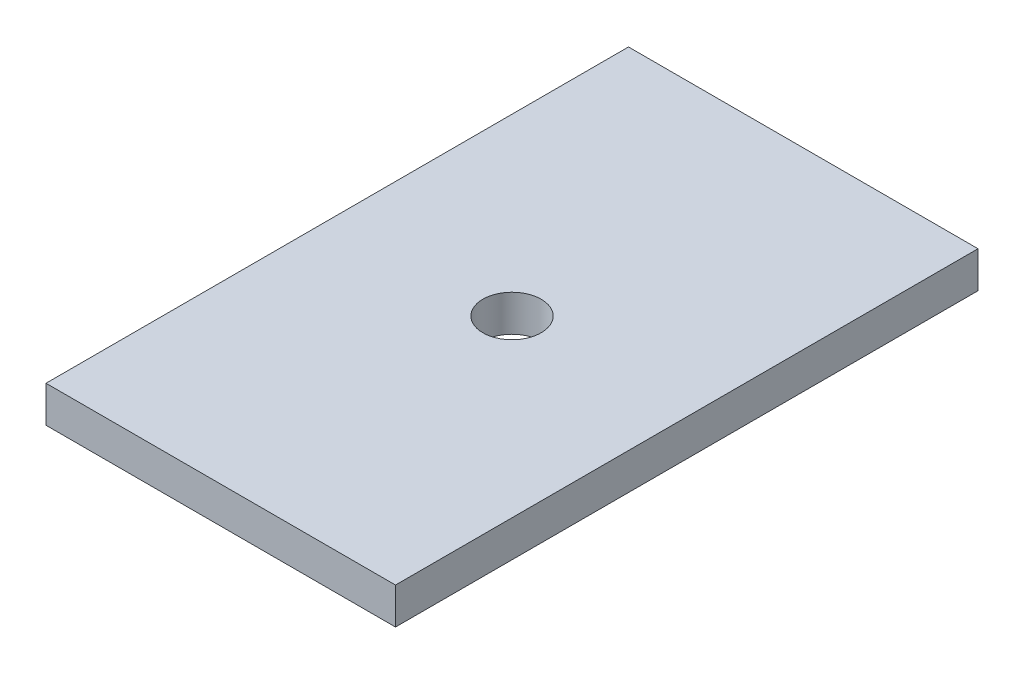
ISO-10303-21;
HEADER;
FILE_DESCRIPTION(('STEP AP214'),'2;1');
FILE_NAME('part.step','',(''),(''),'','','');
FILE_SCHEMA(('AUTOMOTIVE_DESIGN { 1 0 10303 214 1 1 1 1 }'));
ENDSEC;
DATA;
#1=APPLICATION_CONTEXT('core data for automotive mechanical design processes');
#2=APPLICATION_PROTOCOL_DEFINITION('international standard','automotive_design',2000,#1);
#3=PRODUCT_CONTEXT('',#1,'mechanical');
#4=PRODUCT('Part','Part','',(#3));
#5=PRODUCT_RELATED_PRODUCT_CATEGORY('part','',(#4));
#6=PRODUCT_DEFINITION_FORMATION('','',#4);
#7=PRODUCT_DEFINITION_CONTEXT('part definition',#1,'design');
#8=PRODUCT_DEFINITION('design','',#6,#7);
#9=PRODUCT_DEFINITION_SHAPE('','',#8);
#10=(LENGTH_UNIT() NAMED_UNIT(*) SI_UNIT(.MILLI.,.METRE.));
#11=(NAMED_UNIT(*) PLANE_ANGLE_UNIT() SI_UNIT($,.RADIAN.));
#12=(NAMED_UNIT(*) SI_UNIT($,.STERADIAN.) SOLID_ANGLE_UNIT());
#13=UNCERTAINTY_MEASURE_WITH_UNIT(LENGTH_MEASURE(1.E-05),#10,'distance_accuracy_value','');
#14=(GEOMETRIC_REPRESENTATION_CONTEXT(3) GLOBAL_UNCERTAINTY_ASSIGNED_CONTEXT((#13)) GLOBAL_UNIT_ASSIGNED_CONTEXT((#10,
#11,#12)) REPRESENTATION_CONTEXT('',''));
#15=CARTESIAN_POINT('',(0.,0.,0.));
#16=DIRECTION('',(0.,0.,1.));
#17=DIRECTION('',(1.,0.,0.));
#18=AXIS2_PLACEMENT_3D('',#15,#16,#17);
#19=CARTESIAN_POINT('',(152.4,31.75,0.));
#20=DIRECTION('',(1.,0.,0.));
#21=DIRECTION('',(0.,0.,-1.));
#22=AXIS2_PLACEMENT_3D('',#19,#20,#21);
#23=PLANE('',#22);
#24=DIRECTION('',(0.,0.,1.));
#25=VECTOR('',#24,1.);
#26=CARTESIAN_POINT('',(152.4,0.,0.));
#27=LINE('',#26,#25);
#28=CARTESIAN_POINT('',(152.4,0.,0.));
#29=VERTEX_POINT('',#28);
#30=CARTESIAN_POINT('',(152.4,0.,508.));
#31=VERTEX_POINT('',#30);
#32=EDGE_CURVE('E98',#29,#31,#27,.T.);
#33=ORIENTED_EDGE('',*,*,#32,.F.);
#34=DIRECTION('',(0.,-1.,0.));
#35=VECTOR('',#34,1.);
#36=CARTESIAN_POINT('',(152.4,31.75,0.));
#37=LINE('',#36,#35);
#38=CARTESIAN_POINT('',(152.4,31.75,0.));
#39=VERTEX_POINT('',#38);
#40=EDGE_CURVE('E11',#39,#29,#37,.T.);
#41=ORIENTED_EDGE('',*,*,#40,.F.);
#42=DIRECTION('',(0.,0.,1.));
#43=VECTOR('',#42,1.);
#44=CARTESIAN_POINT('',(152.4,31.75,0.));
#45=LINE('',#44,#43);
#46=CARTESIAN_POINT('',(152.4,31.75,508.));
#47=VERTEX_POINT('',#46);
#48=EDGE_CURVE('E90',#39,#47,#45,.T.);
#49=ORIENTED_EDGE('',*,*,#48,.T.);
#50=DIRECTION('',(0.,-1.,0.));
#51=VECTOR('',#50,1.);
#52=CARTESIAN_POINT('',(152.4,31.75,508.));
#53=LINE('',#52,#51);
#54=EDGE_CURVE('E37',#47,#31,#53,.T.);
#55=ORIENTED_EDGE('',*,*,#54,.T.);
#56=EDGE_LOOP('',(#33,#41,#49,#55));
#57=FACE_BOUND('',#56,.T.);
#58=ADVANCED_FACE('F34',(#57),#23,.T.);
#59=CARTESIAN_POINT('',(152.4,31.75,0.));
#60=DIRECTION('',(0.,0.,1.));
#61=DIRECTION('',(1.,0.,0.));
#62=AXIS2_PLACEMENT_3D('',#59,#60,#61);
#63=PLANE('',#62);
#64=DIRECTION('',(-1.,0.,0.));
#65=VECTOR('',#64,1.);
#66=CARTESIAN_POINT('',(152.4,0.,0.));
#67=LINE('',#66,#65);
#68=CARTESIAN_POINT('',(-152.4,0.,0.));
#69=VERTEX_POINT('',#68);
#70=EDGE_CURVE('E105',#29,#69,#67,.T.);
#71=ORIENTED_EDGE('',*,*,#70,.T.);
#72=DIRECTION('',(0.,-1.,0.));
#73=VECTOR('',#72,1.);
#74=CARTESIAN_POINT('',(-152.4,31.75,0.));
#75=LINE('',#74,#73);
#76=CARTESIAN_POINT('',(-152.4,31.75,0.));
#77=VERTEX_POINT('',#76);
#78=EDGE_CURVE('E43',#77,#69,#75,.T.);
#79=ORIENTED_EDGE('',*,*,#78,.F.);
#80=DIRECTION('',(-1.,0.,0.));
#81=VECTOR('',#80,1.);
#82=CARTESIAN_POINT('',(152.4,31.75,0.));
#83=LINE('',#82,#81);
#84=EDGE_CURVE('E93',#39,#77,#83,.T.);
#85=ORIENTED_EDGE('',*,*,#84,.F.);
#86=ORIENTED_EDGE('',*,*,#40,.T.);
#87=EDGE_LOOP('',(#71,#79,#85,#86));
#88=FACE_BOUND('',#87,.T.);
#89=ADVANCED_FACE('F131',(#88),#63,.F.);
#90=CARTESIAN_POINT('',(-152.4,31.75,508.));
#91=DIRECTION('',(-1.,0.,0.));
#92=DIRECTION('',(0.,0.,1.));
#93=AXIS2_PLACEMENT_3D('',#90,#91,#92);
#94=PLANE('',#93);
#95=DIRECTION('',(0.,0.,-1.));
#96=VECTOR('',#95,1.);
#97=CARTESIAN_POINT('',(-152.4,0.,508.));
#98=LINE('',#97,#96);
#99=CARTESIAN_POINT('',(-152.4,0.,508.));
#100=VERTEX_POINT('',#99);
#101=EDGE_CURVE('E85',#100,#69,#98,.T.);
#102=ORIENTED_EDGE('',*,*,#101,.F.);
#103=DIRECTION('',(0.,-1.,0.));
#104=VECTOR('',#103,1.);
#105=CARTESIAN_POINT('',(-152.4,31.75,508.));
#106=LINE('',#105,#104);
#107=CARTESIAN_POINT('',(-152.4,31.75,508.));
#108=VERTEX_POINT('',#107);
#109=EDGE_CURVE('E81',#108,#100,#106,.T.);
#110=ORIENTED_EDGE('',*,*,#109,.F.);
#111=DIRECTION('',(0.,0.,-1.));
#112=VECTOR('',#111,1.);
#113=CARTESIAN_POINT('',(-152.4,31.75,508.));
#114=LINE('',#113,#112);
#115=EDGE_CURVE('E83',#108,#77,#114,.T.);
#116=ORIENTED_EDGE('',*,*,#115,.T.);
#117=ORIENTED_EDGE('',*,*,#78,.T.);
#118=EDGE_LOOP('',(#102,#110,#116,#117));
#119=FACE_BOUND('',#118,.T.);
#120=ADVANCED_FACE('F82',(#119),#94,.T.);
#121=CARTESIAN_POINT('',(-152.4,31.75,508.));
#122=DIRECTION('',(0.,0.,-1.));
#123=DIRECTION('',(-1.,0.,0.));
#124=AXIS2_PLACEMENT_3D('',#121,#122,#123);
#125=PLANE('',#124);
#126=DIRECTION('',(1.,0.,0.));
#127=VECTOR('',#126,1.);
#128=CARTESIAN_POINT('',(-152.4,0.,508.));
#129=LINE('',#128,#127);
#130=EDGE_CURVE('E101',#100,#31,#129,.T.);
#131=ORIENTED_EDGE('',*,*,#130,.T.);
#132=ORIENTED_EDGE('',*,*,#54,.F.);
#133=DIRECTION('',(1.,0.,0.));
#134=VECTOR('',#133,1.);
#135=CARTESIAN_POINT('',(-152.4,31.75,508.));
#136=LINE('',#135,#134);
#137=EDGE_CURVE('E78',#108,#47,#136,.T.);
#138=ORIENTED_EDGE('',*,*,#137,.F.);
#139=ORIENTED_EDGE('',*,*,#109,.T.);
#140=EDGE_LOOP('',(#131,#132,#138,#139));
#141=FACE_BOUND('',#140,.T.);
#142=ADVANCED_FACE('F89',(#141),#125,.F.);
#143=CARTESIAN_POINT('',(152.4,31.75,0.));
#144=DIRECTION('',(0.,-1.,0.));
#145=DIRECTION('',(0.,0.,-1.));
#146=AXIS2_PLACEMENT_3D('',#143,#144,#145);
#147=PLANE('',#146);
#148=CARTESIAN_POINT('',(0.,31.75,254.));
#149=DIRECTION('',(0.,1.,0.));
#150=DIRECTION('',(0.,0.,1.));
#151=AXIS2_PLACEMENT_3D('',#148,#149,#150);
#152=CIRCLE('',#151,25.4);
#153=CARTESIAN_POINT('',(0.,31.75,279.4));
#154=VERTEX_POINT('',#153);
#155=EDGE_CURVE('E108',#154,#154,#152,.T.);
#156=ORIENTED_EDGE('',*,*,#155,.F.);
#157=EDGE_LOOP('',(#156));
#158=FACE_BOUND('',#157,.T.);
#159=ORIENTED_EDGE('',*,*,#48,.F.);
#160=ORIENTED_EDGE('',*,*,#84,.T.);
#161=ORIENTED_EDGE('',*,*,#115,.F.);
#162=ORIENTED_EDGE('',*,*,#137,.T.);
#163=EDGE_LOOP('',(#159,#160,#161,#162));
#164=FACE_BOUND('',#163,.T.);
#165=ADVANCED_FACE('F92',(#158,#164),#147,.F.);
#166=CARTESIAN_POINT('',(152.4,0.,0.));
#167=DIRECTION('',(0.,-1.,0.));
#168=DIRECTION('',(0.,0.,-1.));
#169=AXIS2_PLACEMENT_3D('',#166,#167,#168);
#170=PLANE('',#169);
#171=CARTESIAN_POINT('',(0.,0.,254.));
#172=DIRECTION('',(0.,1.,0.));
#173=DIRECTION('',(0.,0.,1.));
#174=AXIS2_PLACEMENT_3D('',#171,#172,#173);
#175=CIRCLE('',#174,25.4);
#176=CARTESIAN_POINT('',(0.,0.,279.4));
#177=VERTEX_POINT('',#176);
#178=EDGE_CURVE('E102',#177,#177,#175,.T.);
#179=ORIENTED_EDGE('',*,*,#178,.T.);
#180=EDGE_LOOP('',(#179));
#181=FACE_BOUND('',#180,.T.);
#182=ORIENTED_EDGE('',*,*,#32,.T.);
#183=ORIENTED_EDGE('',*,*,#130,.F.);
#184=ORIENTED_EDGE('',*,*,#101,.T.);
#185=ORIENTED_EDGE('',*,*,#70,.F.);
#186=EDGE_LOOP('',(#182,#183,#184,#185));
#187=FACE_BOUND('',#186,.T.);
#188=ADVANCED_FACE('F114',(#181,#187),#170,.T.);
#189=CARTESIAN_POINT('',(0.,0.,254.));
#190=DIRECTION('',(0.,1.,0.));
#191=DIRECTION('',(0.,0.,1.));
#192=AXIS2_PLACEMENT_3D('',#189,#190,#191);
#193=CYLINDRICAL_SURFACE('',#192,25.4);
#194=ORIENTED_EDGE('',*,*,#178,.F.);
#195=EDGE_LOOP('',(#194));
#196=FACE_BOUND('',#195,.T.);
#197=ORIENTED_EDGE('',*,*,#155,.T.);
#198=EDGE_LOOP('',(#197));
#199=FACE_BOUND('',#198,.T.);
#200=ADVANCED_FACE('F117',(#196,#199),#193,.F.);
#201=CLOSED_SHELL('',(#58,#89,#120,#142,#165,#188,#200));
#202=MANIFOLD_SOLID_BREP('B2',#201);
#203=ADVANCED_BREP_SHAPE_REPRESENTATION('',(#18,#202),#14);
#204=SHAPE_DEFINITION_REPRESENTATION(#9,#203);
ENDSEC;
END-ISO-10303-21;
